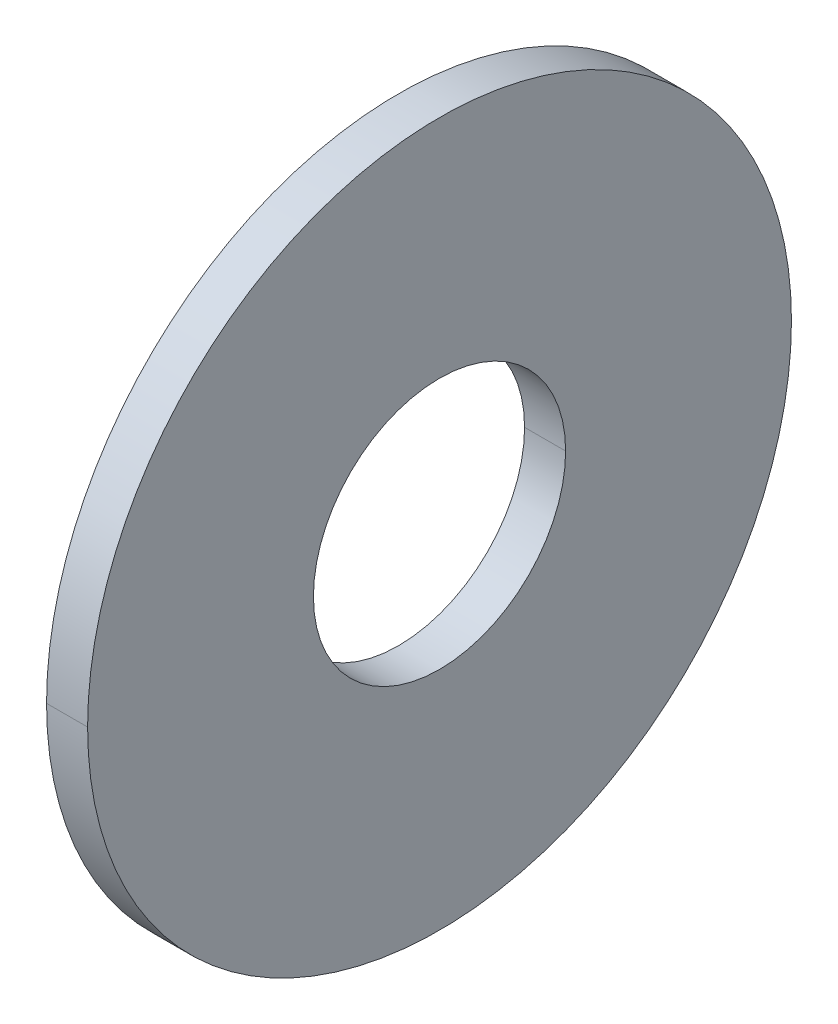
ISO-10303-21;
HEADER;
FILE_DESCRIPTION(('STEP AP214'),'2;1');
FILE_NAME('part.step','',(''),(''),'','','');
FILE_SCHEMA(('AUTOMOTIVE_DESIGN { 1 0 10303 214 1 1 1 1 }'));
ENDSEC;
DATA;
#1=APPLICATION_CONTEXT('core data for automotive mechanical design processes');
#2=APPLICATION_PROTOCOL_DEFINITION('international standard','automotive_design',2000,#1);
#3=PRODUCT_CONTEXT('',#1,'mechanical');
#4=PRODUCT('Part','Part','',(#3));
#5=PRODUCT_RELATED_PRODUCT_CATEGORY('part','',(#4));
#6=PRODUCT_DEFINITION_FORMATION('','',#4);
#7=PRODUCT_DEFINITION_CONTEXT('part definition',#1,'design');
#8=PRODUCT_DEFINITION('design','',#6,#7);
#9=PRODUCT_DEFINITION_SHAPE('','',#8);
#10=(LENGTH_UNIT() NAMED_UNIT(*) SI_UNIT(.MILLI.,.METRE.));
#11=(NAMED_UNIT(*) PLANE_ANGLE_UNIT() SI_UNIT($,.RADIAN.));
#12=(NAMED_UNIT(*) SI_UNIT($,.STERADIAN.) SOLID_ANGLE_UNIT());
#13=UNCERTAINTY_MEASURE_WITH_UNIT(LENGTH_MEASURE(1.E-05),#10,'distance_accuracy_value','');
#14=(GEOMETRIC_REPRESENTATION_CONTEXT(3) GLOBAL_UNCERTAINTY_ASSIGNED_CONTEXT((#13)) GLOBAL_UNIT_ASSIGNED_CONTEXT((#10,
#11,#12)) REPRESENTATION_CONTEXT('',''));
#15=CARTESIAN_POINT('',(0.,0.,0.));
#16=DIRECTION('',(0.,0.,1.));
#17=DIRECTION('',(1.,0.,0.));
#18=AXIS2_PLACEMENT_3D('',#15,#16,#17);
#19=CARTESIAN_POINT('',(-34.925,0.,0.));
#20=DIRECTION('',(-1.,0.,0.));
#21=DIRECTION('',(0.,0.,1.));
#22=AXIS2_PLACEMENT_3D('',#19,#20,#21);
#23=CYLINDRICAL_SURFACE('',#22,6.);
#24=CARTESIAN_POINT('',(0.,0.,0.));
#25=DIRECTION('',(-1.,0.,0.));
#26=DIRECTION('',(0.,0.,1.));
#27=AXIS2_PLACEMENT_3D('',#24,#25,#26);
#28=CIRCLE('',#27,6.);
#29=CARTESIAN_POINT('',(0.,0.,6.));
#30=VERTEX_POINT('',#29);
#31=CARTESIAN_POINT('',(0.,0.,-6.));
#32=VERTEX_POINT('',#31);
#33=EDGE_CURVE('E11',#30,#32,#28,.T.);
#34=ORIENTED_EDGE('',*,*,#33,.T.);
#35=DIRECTION('',(-1.,0.,0.));
#36=VECTOR('',#35,1.);
#37=CARTESIAN_POINT('',(-34.925,0.,-6.));
#38=LINE('',#37,#36);
#39=CARTESIAN_POINT('',(-0.7,0.,-6.));
#40=VERTEX_POINT('',#39);
#41=EDGE_CURVE('E21',#32,#40,#38,.T.);
#42=ORIENTED_EDGE('',*,*,#41,.T.);
#43=CARTESIAN_POINT('',(-0.7,0.,0.));
#44=DIRECTION('',(-1.,0.,0.));
#45=DIRECTION('',(0.,0.,1.));
#46=AXIS2_PLACEMENT_3D('',#43,#44,#45);
#47=CIRCLE('',#46,6.);
#48=CARTESIAN_POINT('',(-0.7,0.,6.));
#49=VERTEX_POINT('',#48);
#50=EDGE_CURVE('E107',#49,#40,#47,.T.);
#51=ORIENTED_EDGE('',*,*,#50,.F.);
#52=DIRECTION('',(-1.,0.,0.));
#53=VECTOR('',#52,1.);
#54=CARTESIAN_POINT('',(-34.925,0.,6.));
#55=LINE('',#54,#53);
#56=EDGE_CURVE('E64',#30,#49,#55,.T.);
#57=ORIENTED_EDGE('',*,*,#56,.F.);
#58=EDGE_LOOP('',(#34,#42,#51,#57));
#59=FACE_BOUND('',#58,.T.);
#60=ADVANCED_FACE('F17',(#59),#23,.T.);
#61=CARTESIAN_POINT('',(-34.925,0.,0.));
#62=DIRECTION('',(-1.,0.,0.));
#63=DIRECTION('',(0.,0.,1.));
#64=AXIS2_PLACEMENT_3D('',#61,#62,#63);
#65=CYLINDRICAL_SURFACE('',#64,2.15);
#66=CARTESIAN_POINT('',(0.,0.,0.));
#67=DIRECTION('',(-1.,0.,0.));
#68=DIRECTION('',(0.,0.,1.));
#69=AXIS2_PLACEMENT_3D('',#66,#67,#68);
#70=CIRCLE('',#69,2.15);
#71=CARTESIAN_POINT('',(0.,0.,-2.15));
#72=VERTEX_POINT('',#71);
#73=CARTESIAN_POINT('',(0.,0.,2.15));
#74=VERTEX_POINT('',#73);
#75=EDGE_CURVE('E74',#72,#74,#70,.T.);
#76=ORIENTED_EDGE('',*,*,#75,.F.);
#77=DIRECTION('',(-1.,0.,0.));
#78=VECTOR('',#77,1.);
#79=CARTESIAN_POINT('',(-34.925,0.,-2.15));
#80=LINE('',#79,#78);
#81=CARTESIAN_POINT('',(-0.7,0.,-2.15));
#82=VERTEX_POINT('',#81);
#83=EDGE_CURVE('E78',#72,#82,#80,.T.);
#84=ORIENTED_EDGE('',*,*,#83,.T.);
#85=CARTESIAN_POINT('',(-0.7,0.,0.));
#86=DIRECTION('',(-1.,0.,0.));
#87=DIRECTION('',(0.,0.,1.));
#88=AXIS2_PLACEMENT_3D('',#85,#86,#87);
#89=CIRCLE('',#88,2.15);
#90=CARTESIAN_POINT('',(-0.7,0.,2.15));
#91=VERTEX_POINT('',#90);
#92=EDGE_CURVE('E94',#82,#91,#89,.T.);
#93=ORIENTED_EDGE('',*,*,#92,.T.);
#94=DIRECTION('',(-1.,0.,0.));
#95=VECTOR('',#94,1.);
#96=CARTESIAN_POINT('',(-34.925,0.,2.15));
#97=LINE('',#96,#95);
#98=EDGE_CURVE('E81',#74,#91,#97,.T.);
#99=ORIENTED_EDGE('',*,*,#98,.F.);
#100=EDGE_LOOP('',(#76,#84,#93,#99));
#101=FACE_BOUND('',#100,.T.);
#102=ADVANCED_FACE('F76',(#101),#65,.F.);
#103=CARTESIAN_POINT('',(-34.925,0.,0.));
#104=DIRECTION('',(-1.,0.,0.));
#105=DIRECTION('',(0.,0.,1.));
#106=AXIS2_PLACEMENT_3D('',#103,#104,#105);
#107=CYLINDRICAL_SURFACE('',#106,2.15);
#108=ORIENTED_EDGE('',*,*,#83,.F.);
#109=CARTESIAN_POINT('',(0.,0.,0.));
#110=DIRECTION('',(-1.,0.,0.));
#111=DIRECTION('',(0.,0.,1.));
#112=AXIS2_PLACEMENT_3D('',#109,#110,#111);
#113=CIRCLE('',#112,2.15);
#114=EDGE_CURVE('E86',#74,#72,#113,.T.);
#115=ORIENTED_EDGE('',*,*,#114,.F.);
#116=ORIENTED_EDGE('',*,*,#98,.T.);
#117=CARTESIAN_POINT('',(-0.7,0.,0.));
#118=DIRECTION('',(-1.,0.,0.));
#119=DIRECTION('',(0.,0.,1.));
#120=AXIS2_PLACEMENT_3D('',#117,#118,#119);
#121=CIRCLE('',#120,2.15);
#122=EDGE_CURVE('E92',#91,#82,#121,.T.);
#123=ORIENTED_EDGE('',*,*,#122,.T.);
#124=EDGE_LOOP('',(#108,#115,#116,#123));
#125=FACE_BOUND('',#124,.T.);
#126=ADVANCED_FACE('F90',(#125),#107,.F.);
#127=CARTESIAN_POINT('',(0.,2.15,0.));
#128=DIRECTION('',(-1.,0.,0.));
#129=DIRECTION('',(0.,0.,1.));
#130=AXIS2_PLACEMENT_3D('',#127,#128,#129);
#131=PLANE('',#130);
#132=ORIENTED_EDGE('',*,*,#33,.F.);
#133=CARTESIAN_POINT('',(0.,0.,0.));
#134=DIRECTION('',(-1.,0.,0.));
#135=DIRECTION('',(0.,0.,1.));
#136=AXIS2_PLACEMENT_3D('',#133,#134,#135);
#137=CIRCLE('',#136,6.);
#138=EDGE_CURVE('E87',#32,#30,#137,.T.);
#139=ORIENTED_EDGE('',*,*,#138,.F.);
#140=EDGE_LOOP('',(#132,#139));
#141=FACE_BOUND('',#140,.T.);
#142=ORIENTED_EDGE('',*,*,#114,.T.);
#143=ORIENTED_EDGE('',*,*,#75,.T.);
#144=EDGE_LOOP('',(#142,#143));
#145=FACE_BOUND('',#144,.T.);
#146=ADVANCED_FACE('F96',(#141,#145),#131,.F.);
#147=CARTESIAN_POINT('',(-34.925,0.,0.));
#148=DIRECTION('',(-1.,0.,0.));
#149=DIRECTION('',(0.,0.,1.));
#150=AXIS2_PLACEMENT_3D('',#147,#148,#149);
#151=CYLINDRICAL_SURFACE('',#150,6.);
#152=ORIENTED_EDGE('',*,*,#41,.F.);
#153=ORIENTED_EDGE('',*,*,#138,.T.);
#154=ORIENTED_EDGE('',*,*,#56,.T.);
#155=CARTESIAN_POINT('',(-0.7,0.,0.));
#156=DIRECTION('',(-1.,0.,0.));
#157=DIRECTION('',(0.,0.,1.));
#158=AXIS2_PLACEMENT_3D('',#155,#156,#157);
#159=CIRCLE('',#158,6.);
#160=EDGE_CURVE('E113',#40,#49,#159,.T.);
#161=ORIENTED_EDGE('',*,*,#160,.F.);
#162=EDGE_LOOP('',(#152,#153,#154,#161));
#163=FACE_BOUND('',#162,.T.);
#164=ADVANCED_FACE('F127',(#163),#151,.T.);
#165=CARTESIAN_POINT('',(-0.7,6.,0.));
#166=DIRECTION('',(1.,0.,0.));
#167=DIRECTION('',(0.,1.,0.));
#168=AXIS2_PLACEMENT_3D('',#165,#166,#167);
#169=PLANE('',#168);
#170=ORIENTED_EDGE('',*,*,#50,.T.);
#171=ORIENTED_EDGE('',*,*,#160,.T.);
#172=EDGE_LOOP('',(#170,#171));
#173=FACE_BOUND('',#172,.T.);
#174=ORIENTED_EDGE('',*,*,#122,.F.);
#175=ORIENTED_EDGE('',*,*,#92,.F.);
#176=EDGE_LOOP('',(#174,#175));
#177=FACE_BOUND('',#176,.T.);
#178=ADVANCED_FACE('F19',(#173,#177),#169,.F.);
#179=CLOSED_SHELL('',(#60,#102,#126,#146,#164,#178));
#180=MANIFOLD_SOLID_BREP('B1',#179);
#181=ADVANCED_BREP_SHAPE_REPRESENTATION('',(#18,#180),#14);
#182=SHAPE_DEFINITION_REPRESENTATION(#9,#181);
ENDSEC;
END-ISO-10303-21;
